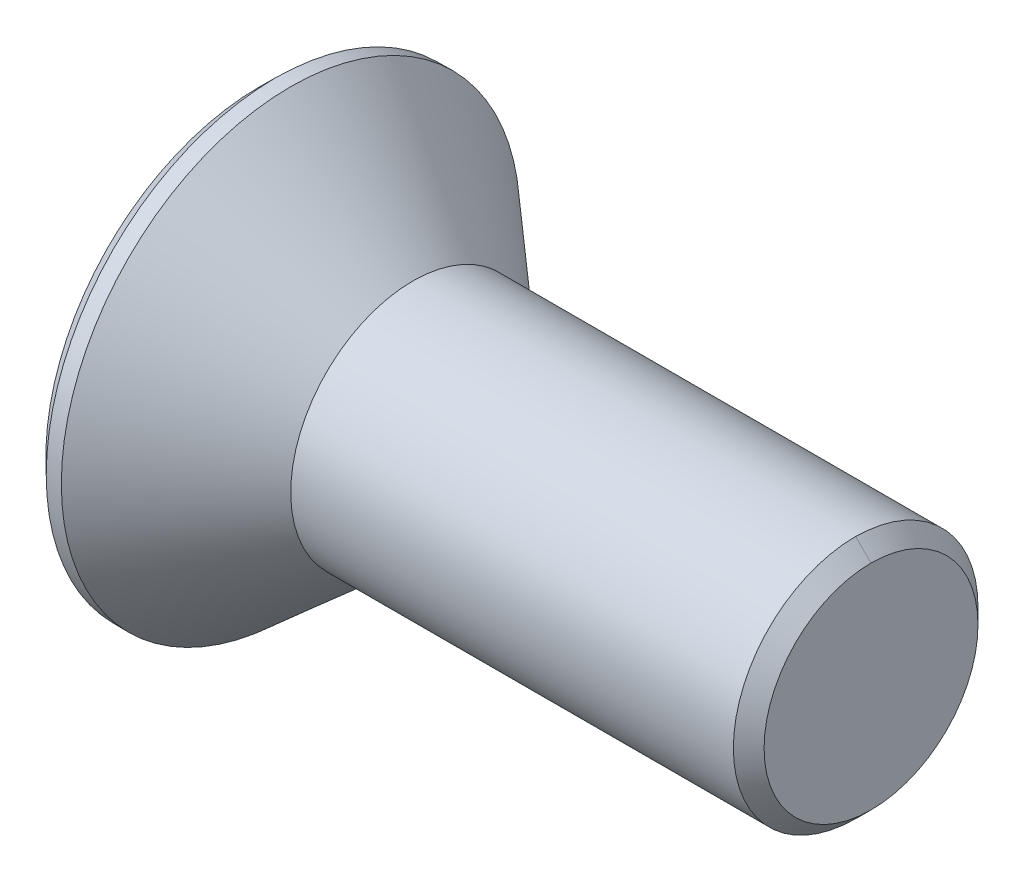
ISO-10303-21;
HEADER;
FILE_DESCRIPTION(('STEP AP214'),'2;1');
FILE_NAME('part.step','',(''),(''),'','','');
FILE_SCHEMA(('AUTOMOTIVE_DESIGN { 1 0 10303 214 1 1 1 1 }'));
ENDSEC;
DATA;
#1=APPLICATION_CONTEXT('core data for automotive mechanical design processes');
#2=APPLICATION_PROTOCOL_DEFINITION('international standard','automotive_design',2000,#1);
#3=PRODUCT_CONTEXT('',#1,'mechanical');
#4=PRODUCT('Part','Part','',(#3));
#5=PRODUCT_RELATED_PRODUCT_CATEGORY('part','',(#4));
#6=PRODUCT_DEFINITION_FORMATION('','',#4);
#7=PRODUCT_DEFINITION_CONTEXT('part definition',#1,'design');
#8=PRODUCT_DEFINITION('design','',#6,#7);
#9=PRODUCT_DEFINITION_SHAPE('','',#8);
#10=(LENGTH_UNIT() NAMED_UNIT(*) SI_UNIT(.MILLI.,.METRE.));
#11=(NAMED_UNIT(*) PLANE_ANGLE_UNIT() SI_UNIT($,.RADIAN.));
#12=(NAMED_UNIT(*) SI_UNIT($,.STERADIAN.) SOLID_ANGLE_UNIT());
#13=UNCERTAINTY_MEASURE_WITH_UNIT(LENGTH_MEASURE(1.E-05),#10,'distance_accuracy_value','');
#14=(GEOMETRIC_REPRESENTATION_CONTEXT(3) GLOBAL_UNCERTAINTY_ASSIGNED_CONTEXT((#13)) GLOBAL_UNIT_ASSIGNED_CONTEXT((#10,
#11,#12)) REPRESENTATION_CONTEXT('',''));
#15=CARTESIAN_POINT('',(0.,0.,0.));
#16=DIRECTION('',(0.,0.,1.));
#17=DIRECTION('',(1.,0.,0.));
#18=AXIS2_PLACEMENT_3D('',#15,#16,#17);
#19=CARTESIAN_POINT('',(0.95,0.,0.));
#20=DIRECTION('',(-1.,0.,0.));
#21=DIRECTION('',(0.,0.,1.));
#22=AXIS2_PLACEMENT_3D('',#19,#20,#21);
#23=PLANE('',#22);
#24=DIRECTION('',(0.,0.,1.));
#25=VECTOR('',#24,1.);
#26=CARTESIAN_POINT('',(0.95,0.25,0.));
#27=LINE('',#26,#25);
#28=CARTESIAN_POINT('',(0.95,0.25,-0.25));
#29=VERTEX_POINT('',#28);
#30=CARTESIAN_POINT('',(0.95,0.25,0.25));
#31=VERTEX_POINT('',#30);
#32=EDGE_CURVE('E341',#29,#31,#27,.T.);
#33=ORIENTED_EDGE('',*,*,#32,.F.);
#34=DIRECTION('',(0.,1.,0.));
#35=VECTOR('',#34,1.);
#36=CARTESIAN_POINT('',(0.95,0.,-0.25));
#37=LINE('',#36,#35);
#38=CARTESIAN_POINT('',(0.95,-0.25,-0.25));
#39=VERTEX_POINT('',#38);
#40=EDGE_CURVE('E277',#39,#29,#37,.T.);
#41=ORIENTED_EDGE('',*,*,#40,.F.);
#42=DIRECTION('',(0.,0.,1.));
#43=VECTOR('',#42,1.);
#44=CARTESIAN_POINT('',(0.95,-0.25,0.));
#45=LINE('',#44,#43);
#46=CARTESIAN_POINT('',(0.95,-0.25,0.25));
#47=VERTEX_POINT('',#46);
#48=EDGE_CURVE('E372',#47,#39,#45,.F.);
#49=ORIENTED_EDGE('',*,*,#48,.F.);
#50=DIRECTION('',(0.,1.,0.));
#51=VECTOR('',#50,1.);
#52=CARTESIAN_POINT('',(0.95,0.,0.25));
#53=LINE('',#52,#51);
#54=EDGE_CURVE('E358',#31,#47,#53,.F.);
#55=ORIENTED_EDGE('',*,*,#54,.F.);
#56=EDGE_LOOP('',(#33,#41,#49,#55));
#57=FACE_BOUND('',#56,.T.);
#58=ADVANCED_FACE('F17',(#57),#23,.T.);
#59=CARTESIAN_POINT('',(0.475,0.,-0.725));
#60=DIRECTION('',(-0.707106781186548,0.,0.707106781186548));
#61=DIRECTION('',(0.707106781186548,0.,0.707106781186548));
#62=AXIS2_PLACEMENT_3D('',#59,#60,#61);
#63=PLANE('',#62);
#64=DIRECTION('',(0.577350269189626,-0.577350269189626,0.577350269189626));
#65=VECTOR('',#64,1.);
#66=CARTESIAN_POINT('',(0.9,0.3,-0.3));
#67=LINE('',#66,#65);
#68=CARTESIAN_POINT('',(0.9,0.3,-0.3));
#69=VERTEX_POINT('',#68);
#70=EDGE_CURVE('E344',#69,#29,#67,.T.);
#71=ORIENTED_EDGE('',*,*,#70,.F.);
#72=DIRECTION('',(-0.707106781186548,0.,-0.707106781186548));
#73=VECTOR('',#72,1.);
#74=CARTESIAN_POINT('',(0.9,0.3,-0.3));
#75=LINE('',#74,#73);
#76=CARTESIAN_POINT('',(0.,0.3,-1.2));
#77=VERTEX_POINT('',#76);
#78=EDGE_CURVE('E330',#69,#77,#75,.T.);
#79=ORIENTED_EDGE('',*,*,#78,.T.);
#80=DIRECTION('',(0.,1.,0.));
#81=VECTOR('',#80,1.);
#82=CARTESIAN_POINT('',(0.,0.,-1.2));
#83=LINE('',#82,#81);
#84=CARTESIAN_POINT('',(0.,-0.3,-1.2));
#85=VERTEX_POINT('',#84);
#86=EDGE_CURVE('E317',#77,#85,#83,.F.);
#87=ORIENTED_EDGE('',*,*,#86,.T.);
#88=DIRECTION('',(0.707106781186548,0.,0.707106781186548));
#89=VECTOR('',#88,1.);
#90=CARTESIAN_POINT('',(0.,-0.3,-1.2));
#91=LINE('',#90,#89);
#92=CARTESIAN_POINT('',(0.9,-0.3,-0.3));
#93=VERTEX_POINT('',#92);
#94=EDGE_CURVE('E377',#85,#93,#91,.T.);
#95=ORIENTED_EDGE('',*,*,#94,.T.);
#96=DIRECTION('',(-0.577350269189626,-0.577350269189626,-0.577350269189626));
#97=VECTOR('',#96,1.);
#98=CARTESIAN_POINT('',(0.95,-0.25,-0.25));
#99=LINE('',#98,#97);
#100=EDGE_CURVE('E369',#39,#93,#99,.T.);
#101=ORIENTED_EDGE('',*,*,#100,.F.);
#102=ORIENTED_EDGE('',*,*,#40,.T.);
#103=EDGE_LOOP('',(#71,#79,#87,#95,#101,#102));
#104=FACE_BOUND('',#103,.T.);
#105=ADVANCED_FACE('F382',(#104),#63,.T.);
#106=CARTESIAN_POINT('',(0.,-0.3,-1.2));
#107=DIRECTION('',(0.,-1.,0.));
#108=DIRECTION('',(0.,0.,-1.));
#109=AXIS2_PLACEMENT_3D('',#106,#107,#108);
#110=PLANE('',#109);
#111=DIRECTION('',(-1.,0.,0.));
#112=VECTOR('',#111,1.);
#113=CARTESIAN_POINT('',(0.,-0.3,-0.3));
#114=LINE('',#113,#112);
#115=CARTESIAN_POINT('',(0.,-0.3,-0.3));
#116=VERTEX_POINT('',#115);
#117=EDGE_CURVE('E375',#116,#93,#114,.F.);
#118=ORIENTED_EDGE('',*,*,#117,.T.);
#119=ORIENTED_EDGE('',*,*,#94,.F.);
#120=DIRECTION('',(0.,0.,-1.));
#121=VECTOR('',#120,1.);
#122=CARTESIAN_POINT('',(0.,-0.3,0.));
#123=LINE('',#122,#121);
#124=EDGE_CURVE('E403',#85,#116,#123,.F.);
#125=ORIENTED_EDGE('',*,*,#124,.T.);
#126=EDGE_LOOP('',(#118,#119,#125));
#127=FACE_BOUND('',#126,.T.);
#128=ADVANCED_FACE('F405',(#127),#110,.F.);
#129=CARTESIAN_POINT('',(0.,-0.3,-0.3));
#130=DIRECTION('',(0.,0.,-1.));
#131=DIRECTION('',(-1.,0.,0.));
#132=AXIS2_PLACEMENT_3D('',#129,#130,#131);
#133=PLANE('',#132);
#134=DIRECTION('',(0.,1.,0.));
#135=VECTOR('',#134,1.);
#136=CARTESIAN_POINT('',(0.,0.,-0.3));
#137=LINE('',#136,#135);
#138=CARTESIAN_POINT('',(0.,-1.2,-0.3));
#139=VERTEX_POINT('',#138);
#140=EDGE_CURVE('E411',#116,#139,#137,.F.);
#141=ORIENTED_EDGE('',*,*,#140,.T.);
#142=DIRECTION('',(-0.707106781186548,-0.707106781186548,0.));
#143=VECTOR('',#142,1.);
#144=CARTESIAN_POINT('',(0.475,-0.725,-0.3));
#145=LINE('',#144,#143);
#146=EDGE_CURVE('E366',#93,#139,#145,.T.);
#147=ORIENTED_EDGE('',*,*,#146,.F.);
#148=ORIENTED_EDGE('',*,*,#117,.F.);
#149=EDGE_LOOP('',(#141,#147,#148));
#150=FACE_BOUND('',#149,.T.);
#151=ADVANCED_FACE('F493',(#150),#133,.F.);
#152=CARTESIAN_POINT('',(0.475,-0.725,0.));
#153=DIRECTION('',(-0.707106781186548,0.707106781186548,0.));
#154=DIRECTION('',(-0.707106781186548,-0.707106781186548,0.));
#155=AXIS2_PLACEMENT_3D('',#152,#153,#154);
#156=PLANE('',#155);
#157=ORIENTED_EDGE('',*,*,#100,.T.);
#158=ORIENTED_EDGE('',*,*,#146,.T.);
#159=DIRECTION('',(0.,0.,-1.));
#160=VECTOR('',#159,1.);
#161=CARTESIAN_POINT('',(0.,-1.2,0.));
#162=LINE('',#161,#160);
#163=CARTESIAN_POINT('',(0.,-1.2,0.3));
#164=VERTEX_POINT('',#163);
#165=EDGE_CURVE('E412',#139,#164,#162,.F.);
#166=ORIENTED_EDGE('',*,*,#165,.T.);
#167=DIRECTION('',(0.707106781186548,0.707106781186548,0.));
#168=VECTOR('',#167,1.);
#169=CARTESIAN_POINT('',(0.,-1.2,0.3));
#170=LINE('',#169,#168);
#171=CARTESIAN_POINT('',(0.9,-0.3,0.3));
#172=VERTEX_POINT('',#171);
#173=EDGE_CURVE('E364',#164,#172,#170,.T.);
#174=ORIENTED_EDGE('',*,*,#173,.T.);
#175=DIRECTION('',(-0.577350269189626,-0.577350269189626,0.577350269189626));
#176=VECTOR('',#175,1.);
#177=CARTESIAN_POINT('',(0.95,-0.25,0.25));
#178=LINE('',#177,#176);
#179=EDGE_CURVE('E355',#47,#172,#178,.T.);
#180=ORIENTED_EDGE('',*,*,#179,.F.);
#181=ORIENTED_EDGE('',*,*,#48,.T.);
#182=EDGE_LOOP('',(#157,#158,#166,#174,#180,#181));
#183=FACE_BOUND('',#182,.T.);
#184=ADVANCED_FACE('F489',(#183),#156,.T.);
#185=CARTESIAN_POINT('',(0.,-1.2,0.3));
#186=DIRECTION('',(0.,0.,1.));
#187=DIRECTION('',(1.,0.,0.));
#188=AXIS2_PLACEMENT_3D('',#185,#186,#187);
#189=PLANE('',#188);
#190=DIRECTION('',(1.,0.,0.));
#191=VECTOR('',#190,1.);
#192=CARTESIAN_POINT('',(0.,-0.3,0.3));
#193=LINE('',#192,#191);
#194=CARTESIAN_POINT('',(0.,-0.3,0.3));
#195=VERTEX_POINT('',#194);
#196=EDGE_CURVE('E361',#195,#172,#193,.T.);
#197=ORIENTED_EDGE('',*,*,#196,.T.);
#198=ORIENTED_EDGE('',*,*,#173,.F.);
#199=DIRECTION('',(0.,1.,0.));
#200=VECTOR('',#199,1.);
#201=CARTESIAN_POINT('',(0.,0.,0.3));
#202=LINE('',#201,#200);
#203=EDGE_CURVE('E416',#164,#195,#202,.T.);
#204=ORIENTED_EDGE('',*,*,#203,.T.);
#205=EDGE_LOOP('',(#197,#198,#204));
#206=FACE_BOUND('',#205,.T.);
#207=ADVANCED_FACE('F485',(#206),#189,.F.);
#208=CARTESIAN_POINT('',(0.,-0.3,0.3));
#209=DIRECTION('',(0.,-1.,0.));
#210=DIRECTION('',(0.,0.,-1.));
#211=AXIS2_PLACEMENT_3D('',#208,#209,#210);
#212=PLANE('',#211);
#213=DIRECTION('',(0.,0.,-1.));
#214=VECTOR('',#213,1.);
#215=CARTESIAN_POINT('',(0.,-0.3,0.));
#216=LINE('',#215,#214);
#217=CARTESIAN_POINT('',(0.,-0.3,1.2));
#218=VERTEX_POINT('',#217);
#219=EDGE_CURVE('E418',#195,#218,#216,.F.);
#220=ORIENTED_EDGE('',*,*,#219,.T.);
#221=DIRECTION('',(-0.707106781186548,0.,0.707106781186548));
#222=VECTOR('',#221,1.);
#223=CARTESIAN_POINT('',(0.475,-0.3,0.725));
#224=LINE('',#223,#222);
#225=EDGE_CURVE('E352',#172,#218,#224,.T.);
#226=ORIENTED_EDGE('',*,*,#225,.F.);
#227=ORIENTED_EDGE('',*,*,#196,.F.);
#228=EDGE_LOOP('',(#220,#226,#227));
#229=FACE_BOUND('',#228,.T.);
#230=ADVANCED_FACE('F481',(#229),#212,.F.);
#231=CARTESIAN_POINT('',(0.475,0.,0.725));
#232=DIRECTION('',(-0.707106781186548,0.,-0.707106781186548));
#233=DIRECTION('',(-0.707106781186548,0.,0.707106781186548));
#234=AXIS2_PLACEMENT_3D('',#231,#232,#233);
#235=PLANE('',#234);
#236=ORIENTED_EDGE('',*,*,#179,.T.);
#237=ORIENTED_EDGE('',*,*,#225,.T.);
#238=DIRECTION('',(0.,1.,0.));
#239=VECTOR('',#238,1.);
#240=CARTESIAN_POINT('',(0.,0.,1.2));
#241=LINE('',#240,#239);
#242=CARTESIAN_POINT('',(0.,0.3,1.2));
#243=VERTEX_POINT('',#242);
#244=EDGE_CURVE('E420',#218,#243,#241,.T.);
#245=ORIENTED_EDGE('',*,*,#244,.T.);
#246=DIRECTION('',(0.707106781186548,0.,-0.707106781186548));
#247=VECTOR('',#246,1.);
#248=CARTESIAN_POINT('',(0.,0.3,1.2));
#249=LINE('',#248,#247);
#250=CARTESIAN_POINT('',(0.9,0.3,0.3));
#251=VERTEX_POINT('',#250);
#252=EDGE_CURVE('E350',#243,#251,#249,.T.);
#253=ORIENTED_EDGE('',*,*,#252,.T.);
#254=DIRECTION('',(-0.577350269189626,0.577350269189626,0.577350269189626));
#255=VECTOR('',#254,1.);
#256=CARTESIAN_POINT('',(0.95,0.25,0.25));
#257=LINE('',#256,#255);
#258=EDGE_CURVE('E338',#31,#251,#257,.T.);
#259=ORIENTED_EDGE('',*,*,#258,.F.);
#260=ORIENTED_EDGE('',*,*,#54,.T.);
#261=EDGE_LOOP('',(#236,#237,#245,#253,#259,#260));
#262=FACE_BOUND('',#261,.T.);
#263=ADVANCED_FACE('F477',(#262),#235,.T.);
#264=CARTESIAN_POINT('',(0.,0.3,1.2));
#265=DIRECTION('',(0.,1.,0.));
#266=DIRECTION('',(0.,0.,1.));
#267=AXIS2_PLACEMENT_3D('',#264,#265,#266);
#268=PLANE('',#267);
#269=DIRECTION('',(1.,0.,0.));
#270=VECTOR('',#269,1.);
#271=CARTESIAN_POINT('',(0.,0.3,0.3));
#272=LINE('',#271,#270);
#273=CARTESIAN_POINT('',(0.,0.3,0.3));
#274=VERTEX_POINT('',#273);
#275=EDGE_CURVE('E347',#274,#251,#272,.T.);
#276=ORIENTED_EDGE('',*,*,#275,.T.);
#277=ORIENTED_EDGE('',*,*,#252,.F.);
#278=DIRECTION('',(0.,0.,-1.));
#279=VECTOR('',#278,1.);
#280=CARTESIAN_POINT('',(0.,0.3,0.));
#281=LINE('',#280,#279);
#282=EDGE_CURVE('E422',#243,#274,#281,.T.);
#283=ORIENTED_EDGE('',*,*,#282,.T.);
#284=EDGE_LOOP('',(#276,#277,#283));
#285=FACE_BOUND('',#284,.T.);
#286=ADVANCED_FACE('F473',(#285),#268,.F.);
#287=CARTESIAN_POINT('',(0.,0.3,0.3));
#288=DIRECTION('',(0.,0.,1.));
#289=DIRECTION('',(1.,0.,0.));
#290=AXIS2_PLACEMENT_3D('',#287,#288,#289);
#291=PLANE('',#290);
#292=DIRECTION('',(0.,1.,0.));
#293=VECTOR('',#292,1.);
#294=CARTESIAN_POINT('',(0.,0.,0.3));
#295=LINE('',#294,#293);
#296=CARTESIAN_POINT('',(0.,1.2,0.3));
#297=VERTEX_POINT('',#296);
#298=EDGE_CURVE('E424',#274,#297,#295,.T.);
#299=ORIENTED_EDGE('',*,*,#298,.T.);
#300=DIRECTION('',(0.707106781186548,-0.707106781186548,0.));
#301=VECTOR('',#300,1.);
#302=CARTESIAN_POINT('',(0.475,0.725,0.3));
#303=LINE('',#302,#301);
#304=EDGE_CURVE('E335',#251,#297,#303,.F.);
#305=ORIENTED_EDGE('',*,*,#304,.F.);
#306=ORIENTED_EDGE('',*,*,#275,.F.);
#307=EDGE_LOOP('',(#299,#305,#306));
#308=FACE_BOUND('',#307,.T.);
#309=ADVANCED_FACE('F470',(#308),#291,.F.);
#310=CARTESIAN_POINT('',(0.475,0.725,0.));
#311=DIRECTION('',(-0.707106781186548,-0.707106781186548,0.));
#312=DIRECTION('',(0.707106781186548,-0.707106781186548,0.));
#313=AXIS2_PLACEMENT_3D('',#310,#311,#312);
#314=PLANE('',#313);
#315=ORIENTED_EDGE('',*,*,#258,.T.);
#316=ORIENTED_EDGE('',*,*,#304,.T.);
#317=DIRECTION('',(0.,0.,-1.));
#318=VECTOR('',#317,1.);
#319=CARTESIAN_POINT('',(0.,1.2,0.));
#320=LINE('',#319,#318);
#321=CARTESIAN_POINT('',(0.,1.2,-0.3));
#322=VERTEX_POINT('',#321);
#323=EDGE_CURVE('E389',#297,#322,#320,.T.);
#324=ORIENTED_EDGE('',*,*,#323,.T.);
#325=DIRECTION('',(0.707106781186548,-0.707106781186548,0.));
#326=VECTOR('',#325,1.);
#327=CARTESIAN_POINT('',(0.,1.2,-0.3));
#328=LINE('',#327,#326);
#329=EDGE_CURVE('E332',#322,#69,#328,.T.);
#330=ORIENTED_EDGE('',*,*,#329,.T.);
#331=ORIENTED_EDGE('',*,*,#70,.T.);
#332=ORIENTED_EDGE('',*,*,#32,.T.);
#333=EDGE_LOOP('',(#315,#316,#324,#330,#331,#332));
#334=FACE_BOUND('',#333,.T.);
#335=ADVANCED_FACE('F386',(#334),#314,.T.);
#336=CARTESIAN_POINT('',(0.,1.2,-0.3));
#337=DIRECTION('',(0.,0.,-1.));
#338=DIRECTION('',(-1.,0.,0.));
#339=AXIS2_PLACEMENT_3D('',#336,#337,#338);
#340=PLANE('',#339);
#341=DIRECTION('',(1.,0.,0.));
#342=VECTOR('',#341,1.);
#343=CARTESIAN_POINT('',(0.,0.3,-0.3));
#344=LINE('',#343,#342);
#345=CARTESIAN_POINT('',(0.,0.3,-0.3));
#346=VERTEX_POINT('',#345);
#347=EDGE_CURVE('E322',#346,#69,#344,.T.);
#348=ORIENTED_EDGE('',*,*,#347,.T.);
#349=ORIENTED_EDGE('',*,*,#329,.F.);
#350=DIRECTION('',(0.,1.,0.));
#351=VECTOR('',#350,1.);
#352=CARTESIAN_POINT('',(0.,0.,-0.3));
#353=LINE('',#352,#351);
#354=EDGE_CURVE('E395',#322,#346,#353,.F.);
#355=ORIENTED_EDGE('',*,*,#354,.T.);
#356=EDGE_LOOP('',(#348,#349,#355));
#357=FACE_BOUND('',#356,.T.);
#358=ADVANCED_FACE('F394',(#357),#340,.F.);
#359=CARTESIAN_POINT('',(0.,0.3,-0.3));
#360=DIRECTION('',(0.,1.,0.));
#361=DIRECTION('',(0.,0.,1.));
#362=AXIS2_PLACEMENT_3D('',#359,#360,#361);
#363=PLANE('',#362);
#364=DIRECTION('',(0.,0.,-1.));
#365=VECTOR('',#364,1.);
#366=CARTESIAN_POINT('',(0.,0.3,0.));
#367=LINE('',#366,#365);
#368=EDGE_CURVE('E139',#346,#77,#367,.T.);
#369=ORIENTED_EDGE('',*,*,#368,.T.);
#370=ORIENTED_EDGE('',*,*,#78,.F.);
#371=ORIENTED_EDGE('',*,*,#347,.F.);
#372=EDGE_LOOP('',(#369,#370,#371));
#373=FACE_BOUND('',#372,.T.);
#374=ADVANCED_FACE('F399',(#373),#363,.F.);
#375=CARTESIAN_POINT('',(0.,0.,0.));
#376=DIRECTION('',(1.,0.,0.));
#377=DIRECTION('',(0.,0.,-1.));
#378=AXIS2_PLACEMENT_3D('',#375,#376,#377);
#379=PLANE('',#378);
#380=ORIENTED_EDGE('',*,*,#354,.F.);
#381=ORIENTED_EDGE('',*,*,#323,.F.);
#382=ORIENTED_EDGE('',*,*,#298,.F.);
#383=ORIENTED_EDGE('',*,*,#282,.F.);
#384=ORIENTED_EDGE('',*,*,#244,.F.);
#385=ORIENTED_EDGE('',*,*,#219,.F.);
#386=ORIENTED_EDGE('',*,*,#203,.F.);
#387=ORIENTED_EDGE('',*,*,#165,.F.);
#388=ORIENTED_EDGE('',*,*,#140,.F.);
#389=ORIENTED_EDGE('',*,*,#124,.F.);
#390=ORIENTED_EDGE('',*,*,#86,.F.);
#391=ORIENTED_EDGE('',*,*,#368,.F.);
#392=EDGE_LOOP('',(#380,#381,#382,#383,#384,#385,#386,#387,#388,#389,#390,#391));
#393=FACE_BOUND('',#392,.T.);
#394=CARTESIAN_POINT('',(-0.00129879623500528,0.,0.));
#395=DIRECTION('',(1.,0.,0.));
#396=DIRECTION('',(0.,1.,0.));
#397=AXIS2_PLACEMENT_3D('',#394,#395,#396);
#398=CIRCLE('',#397,1.40086143284179);
#399=CARTESIAN_POINT('',(-0.000649398117502644,1.4008614328434,0.));
#400=VERTEX_POINT('',#399);
#401=CARTESIAN_POINT('',(-0.00064939811750264,-1.4008614328434,0.));
#402=VERTEX_POINT('',#401);
#403=EDGE_CURVE('E312',#400,#402,#398,.T.);
#404=ORIENTED_EDGE('',*,*,#403,.F.);
#405=CARTESIAN_POINT('',(-0.00129879623500528,0.,0.));
#406=DIRECTION('',(1.,0.,0.));
#407=DIRECTION('',(0.,-1.,0.));
#408=AXIS2_PLACEMENT_3D('',#405,#406,#407);
#409=CIRCLE('',#408,1.40086143284179);
#410=EDGE_CURVE('E138',#402,#400,#409,.T.);
#411=ORIENTED_EDGE('',*,*,#410,.F.);
#412=EDGE_LOOP('',(#404,#411));
#413=FACE_BOUND('',#412,.T.);
#414=ADVANCED_FACE('F409',(#393,#413),#379,.F.);
#415=CARTESIAN_POINT('',(0.099080190807399,0.,0.));
#416=DIRECTION('',(1.,0.,0.));
#417=DIRECTION('',(0.,1.,0.));
#418=AXIS2_PLACEMENT_3D('',#415,#416,#417);
#419=CONICAL_SURFACE('',#418,1.50139545053207,0.786169793971148);
#420=CARTESIAN_POINT('',(0.1004777966053,0.,0.));
#421=DIRECTION('',(1.,0.,0.));
#422=DIRECTION('',(0.,-1.,0.));
#423=AXIS2_PLACEMENT_3D('',#420,#421,#422);
#424=CIRCLE('',#423,1.5);
#425=CARTESIAN_POINT('',(0.0997789937063495,-1.50069772526604,0.));
#426=VERTEX_POINT('',#425);
#427=CARTESIAN_POINT('',(0.0997789937063495,1.50069772526604,0.));
#428=VERTEX_POINT('',#427);
#429=EDGE_CURVE('E123',#426,#428,#424,.T.);
#430=ORIENTED_EDGE('',*,*,#429,.F.);
#431=CARTESIAN_POINT('',(0.1004777966053,0.,0.));
#432=DIRECTION('',(1.,0.,0.));
#433=DIRECTION('',(0.,1.,0.));
#434=AXIS2_PLACEMENT_3D('',#431,#432,#433);
#435=CIRCLE('',#434,1.5);
#436=EDGE_CURVE('E128',#428,#426,#435,.T.);
#437=ORIENTED_EDGE('',*,*,#436,.F.);
#438=EDGE_LOOP('',(#430,#437));
#439=FACE_BOUND('',#438,.T.);
#440=ORIENTED_EDGE('',*,*,#403,.T.);
#441=ORIENTED_EDGE('',*,*,#410,.T.);
#442=EDGE_LOOP('',(#440,#441));
#443=FACE_BOUND('',#442,.T.);
#444=ADVANCED_FACE('F126',(#439,#443),#419,.T.);
#445=CARTESIAN_POINT('',(4.,0.,0.));
#446=DIRECTION('',(1.,0.,0.));
#447=DIRECTION('',(0.,0.,-1.));
#448=AXIS2_PLACEMENT_3D('',#445,#446,#447);
#449=PLANE('',#448);
#450=CARTESIAN_POINT('',(4.0007244355138,0.,0.));
#451=DIRECTION('',(-1.,0.,0.));
#452=DIRECTION('',(0.,1.,0.));
#453=AXIS2_PLACEMENT_3D('',#450,#451,#452);
#454=CIRCLE('',#453,0.700152072283799);
#455=CARTESIAN_POINT('',(4.00035893076276,0.700141801973096,0.));
#456=VERTEX_POINT('',#455);
#457=CARTESIAN_POINT('',(4.00035893076276,-0.700141801973096,0.));
#458=VERTEX_POINT('',#457);
#459=EDGE_CURVE('E233',#456,#458,#454,.T.);
#460=ORIENTED_EDGE('',*,*,#459,.F.);
#461=CARTESIAN_POINT('',(4.00071058896856,0.,0.));
#462=DIRECTION('',(-1.,0.,0.));
#463=DIRECTION('',(0.,-1.,0.));
#464=AXIS2_PLACEMENT_3D('',#461,#462,#463);
#465=CIRCLE('',#464,0.700138242962112);
#466=EDGE_CURVE('E266',#458,#456,#465,.T.);
#467=ORIENTED_EDGE('',*,*,#466,.F.);
#468=EDGE_LOOP('',(#460,#467));
#469=FACE_BOUND('',#468,.T.);
#470=ADVANCED_FACE('F238',(#469),#449,.T.);
#471=CARTESIAN_POINT('',(3.90015512965647,0.,0.));
#472=DIRECTION('',(-1.,0.,0.));
#473=DIRECTION('',(0.,-1.,0.));
#474=AXIS2_PLACEMENT_3D('',#471,#472,#473);
#475=CONICAL_SURFACE('',#474,0.800815761408558,0.786004719642583);
#476=CARTESIAN_POINT('',(4.0007244355138,-0.700152072283799,0.));
#477=DIRECTION('',(-0.706663758183983,-0.707549526796032,0.));
#478=VECTOR('',#477,1.);
#479=LINE('',#476,#478);
#480=CARTESIAN_POINT('',(3.8997508061536,-0.800411919633245,0.));
#481=VERTEX_POINT('',#480);
#482=EDGE_CURVE('E131',#458,#481,#479,.T.);
#483=ORIENTED_EDGE('',*,*,#482,.F.);
#484=ORIENTED_EDGE('',*,*,#466,.T.);
#485=CARTESIAN_POINT('',(3.90017098362705,0.80083156302635,0.));
#486=DIRECTION('',(0.706663758183983,-0.707549526796032,0.));
#487=VECTOR('',#486,1.);
#488=LINE('',#485,#487);
#489=CARTESIAN_POINT('',(3.8997508061536,0.800411919633245,0.));
#490=VERTEX_POINT('',#489);
#491=EDGE_CURVE('E213',#490,#456,#488,.T.);
#492=ORIENTED_EDGE('',*,*,#491,.F.);
#493=CARTESIAN_POINT('',(3.899338378088,0.,0.));
#494=DIRECTION('',(-1.,0.,0.));
#495=DIRECTION('',(0.,-1.,0.));
#496=AXIS2_PLACEMENT_3D('',#493,#494,#495);
#497=CIRCLE('',#496,0.8);
#498=EDGE_CURVE('E37',#481,#490,#497,.T.);
#499=ORIENTED_EDGE('',*,*,#498,.F.);
#500=EDGE_LOOP('',(#483,#484,#492,#499));
#501=FACE_BOUND('',#500,.T.);
#502=ADVANCED_FACE('F161',(#501),#475,.T.);
#503=CARTESIAN_POINT('',(0.,0.,0.));
#504=DIRECTION('',(1.,0.,0.));
#505=DIRECTION('',(0.,0.,-1.));
#506=AXIS2_PLACEMENT_3D('',#503,#504,#505);
#507=CYLINDRICAL_SURFACE('',#506,1.5);
#508=ORIENTED_EDGE('',*,*,#429,.T.);
#509=ORIENTED_EDGE('',*,*,#436,.T.);
#510=EDGE_LOOP('',(#508,#509));
#511=FACE_BOUND('',#510,.T.);
#512=CARTESIAN_POINT('',(0.200752501825718,0.,0.));
#513=DIRECTION('',(1.,0.,0.));
#514=DIRECTION('',(0.,1.,0.));
#515=AXIS2_PLACEMENT_3D('',#512,#513,#514);
#516=CIRCLE('',#515,1.50135672384977);
#517=CARTESIAN_POINT('',(0.200158137384009,1.50067836192488,0.));
#518=VERTEX_POINT('',#517);
#519=CARTESIAN_POINT('',(0.200158137384009,-1.50067836192488,0.));
#520=VERTEX_POINT('',#519);
#521=EDGE_CURVE('E132',#518,#520,#516,.T.);
#522=ORIENTED_EDGE('',*,*,#521,.F.);
#523=CARTESIAN_POINT('',(0.200752501825718,0.,0.));
#524=DIRECTION('',(1.,0.,0.));
#525=DIRECTION('',(0.,-1.,0.));
#526=AXIS2_PLACEMENT_3D('',#523,#524,#525);
#527=CIRCLE('',#526,1.50135672384977);
#528=EDGE_CURVE('E267',#520,#518,#527,.T.);
#529=ORIENTED_EDGE('',*,*,#528,.F.);
#530=EDGE_LOOP('',(#522,#529));
#531=FACE_BOUND('',#530,.T.);
#532=ADVANCED_FACE('F136',(#511,#531),#507,.T.);
#533=CARTESIAN_POINT('',(3.90017098362705,0.,0.));
#534=DIRECTION('',(-1.,0.,0.));
#535=DIRECTION('',(0.,0.,1.));
#536=AXIS2_PLACEMENT_3D('',#533,#534,#535);
#537=CONICAL_SURFACE('',#536,0.80083156302635,0.786024496430541);
#538=ORIENTED_EDGE('',*,*,#491,.T.);
#539=ORIENTED_EDGE('',*,*,#459,.T.);
#540=ORIENTED_EDGE('',*,*,#482,.T.);
#541=CARTESIAN_POINT('',(3.9010015056345,0.,0.));
#542=DIRECTION('',(-1.,0.,0.));
#543=DIRECTION('',(0.,0.,1.));
#544=AXIS2_PLACEMENT_3D('',#541,#542,#543);
#545=CIRCLE('',#544,0.8);
#546=EDGE_CURVE('E28',#490,#481,#545,.T.);
#547=ORIENTED_EDGE('',*,*,#546,.F.);
#548=EDGE_LOOP('',(#538,#539,#540,#547));
#549=FACE_BOUND('',#548,.T.);
#550=ADVANCED_FACE('F160',(#549),#537,.T.);
#551=CARTESIAN_POINT('',(0.200752501825718,0.,0.));
#552=DIRECTION('',(-1.,0.,0.));
#553=DIRECTION('',(0.,0.,1.));
#554=AXIS2_PLACEMENT_3D('',#551,#552,#553);
#555=CONICAL_SURFACE('',#554,1.50135672384977,0.719495680477631);
#556=ORIENTED_EDGE('',*,*,#528,.T.);
#557=ORIENTED_EDGE('',*,*,#521,.T.);
#558=EDGE_LOOP('',(#556,#557));
#559=FACE_BOUND('',#558,.T.);
#560=CARTESIAN_POINT('',(1.001227179814,0.,0.));
#561=DIRECTION('',(1.,0.,0.));
#562=DIRECTION('',(0.,0.,-1.));
#563=AXIS2_PLACEMENT_3D('',#560,#561,#562);
#564=CIRCLE('',#563,0.8);
#565=CARTESIAN_POINT('',(1.001227179814,0.,-0.8));
#566=VERTEX_POINT('',#565);
#567=EDGE_CURVE('E11',#566,#566,#564,.T.);
#568=ORIENTED_EDGE('',*,*,#567,.F.);
#569=EDGE_LOOP('',(#568));
#570=FACE_BOUND('',#569,.T.);
#571=ADVANCED_FACE('F294',(#559,#570),#555,.T.);
#572=CARTESIAN_POINT('',(1.,0.,0.));
#573=DIRECTION('',(1.,0.,0.));
#574=DIRECTION('',(0.,0.,-1.));
#575=AXIS2_PLACEMENT_3D('',#572,#573,#574);
#576=CYLINDRICAL_SURFACE('',#575,0.8);
#577=ORIENTED_EDGE('',*,*,#498,.T.);
#578=ORIENTED_EDGE('',*,*,#546,.T.);
#579=EDGE_LOOP('',(#577,#578));
#580=FACE_BOUND('',#579,.T.);
#581=ORIENTED_EDGE('',*,*,#567,.T.);
#582=EDGE_LOOP('',(#581));
#583=FACE_BOUND('',#582,.T.);
#584=ADVANCED_FACE('F286',(#580,#583),#576,.T.);
#585=CLOSED_SHELL('',(#58,#105,#128,#151,#184,#207,#230,#263,#286,#309,#335,#358,#374,#414,#444,
#470,#502,#532,#550,#571,#584));
#586=MANIFOLD_SOLID_BREP('B1',#585);
#587=ADVANCED_BREP_SHAPE_REPRESENTATION('',(#18,#586),#14);
#588=SHAPE_DEFINITION_REPRESENTATION(#9,#587);
ENDSEC;
END-ISO-10303-21;
